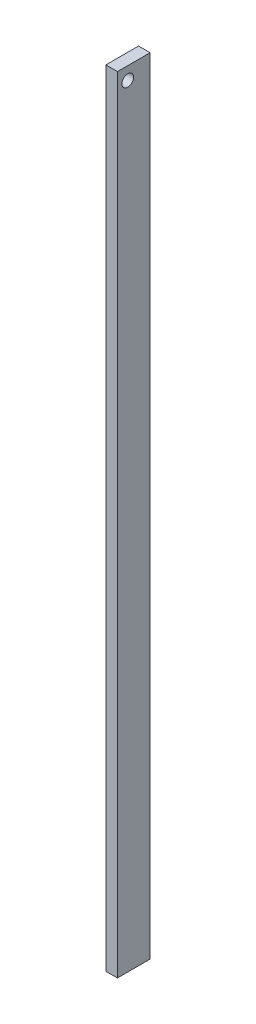
ISO-10303-21;
HEADER;
FILE_DESCRIPTION(('STEP AP214'),'2;1');
FILE_NAME('part.step','',(''),(''),'','','');
FILE_SCHEMA(('AUTOMOTIVE_DESIGN { 1 0 10303 214 1 1 1 1 }'));
ENDSEC;
DATA;
#1=APPLICATION_CONTEXT('core data for automotive mechanical design processes');
#2=APPLICATION_PROTOCOL_DEFINITION('international standard','automotive_design',2000,#1);
#3=PRODUCT_CONTEXT('',#1,'mechanical');
#4=PRODUCT('Part','Part','',(#3));
#5=PRODUCT_RELATED_PRODUCT_CATEGORY('part','',(#4));
#6=PRODUCT_DEFINITION_FORMATION('','',#4);
#7=PRODUCT_DEFINITION_CONTEXT('part definition',#1,'design');
#8=PRODUCT_DEFINITION('design','',#6,#7);
#9=PRODUCT_DEFINITION_SHAPE('','',#8);
#10=(LENGTH_UNIT() NAMED_UNIT(*) SI_UNIT(.MILLI.,.METRE.));
#11=(NAMED_UNIT(*) PLANE_ANGLE_UNIT() SI_UNIT($,.RADIAN.));
#12=(NAMED_UNIT(*) SI_UNIT($,.STERADIAN.) SOLID_ANGLE_UNIT());
#13=UNCERTAINTY_MEASURE_WITH_UNIT(LENGTH_MEASURE(1.E-05),#10,'distance_accuracy_value','');
#14=(GEOMETRIC_REPRESENTATION_CONTEXT(3) GLOBAL_UNCERTAINTY_ASSIGNED_CONTEXT((#13)) GLOBAL_UNIT_ASSIGNED_CONTEXT((#10,
#11,#12)) REPRESENTATION_CONTEXT('',''));
#15=CARTESIAN_POINT('',(0.,0.,0.));
#16=DIRECTION('',(0.,0.,1.));
#17=DIRECTION('',(1.,0.,0.));
#18=AXIS2_PLACEMENT_3D('',#15,#16,#17);
#19=CARTESIAN_POINT('',(0.,304.8,0.));
#20=DIRECTION('',(1.,0.,0.));
#21=DIRECTION('',(0.,0.,-1.));
#22=AXIS2_PLACEMENT_3D('',#19,#20,#21);
#23=PLANE('',#22);
#24=CARTESIAN_POINT('',(0.,299.8,-4.));
#25=DIRECTION('',(-1.,0.,0.));
#26=DIRECTION('',(0.,0.,1.));
#27=AXIS2_PLACEMENT_3D('',#24,#25,#26);
#28=CIRCLE('',#27,2.25);
#29=CARTESIAN_POINT('',(0.,299.8,-1.75));
#30=VERTEX_POINT('',#29);
#31=EDGE_CURVE('E110',#30,#30,#28,.T.);
#32=ORIENTED_EDGE('',*,*,#31,.F.);
#33=EDGE_LOOP('',(#32));
#34=FACE_BOUND('',#33,.T.);
#35=DIRECTION('',(0.,0.,1.));
#36=VECTOR('',#35,1.);
#37=CARTESIAN_POINT('',(0.,0.,0.));
#38=LINE('',#37,#36);
#39=CARTESIAN_POINT('',(0.,0.,-12.7));
#40=VERTEX_POINT('',#39);
#41=CARTESIAN_POINT('',(0.,0.,0.));
#42=VERTEX_POINT('',#41);
#43=EDGE_CURVE('E96',#40,#42,#38,.T.);
#44=ORIENTED_EDGE('',*,*,#43,.T.);
#45=DIRECTION('',(0.,-1.,0.));
#46=VECTOR('',#45,1.);
#47=CARTESIAN_POINT('',(0.,304.8,0.));
#48=LINE('',#47,#46);
#49=CARTESIAN_POINT('',(0.,304.8,0.));
#50=VERTEX_POINT('',#49);
#51=EDGE_CURVE('E11',#50,#42,#48,.T.);
#52=ORIENTED_EDGE('',*,*,#51,.F.);
#53=DIRECTION('',(0.,0.,1.));
#54=VECTOR('',#53,1.);
#55=CARTESIAN_POINT('',(0.,304.8,0.));
#56=LINE('',#55,#54);
#57=CARTESIAN_POINT('',(0.,304.8,-12.7));
#58=VERTEX_POINT('',#57);
#59=EDGE_CURVE('E84',#58,#50,#56,.T.);
#60=ORIENTED_EDGE('',*,*,#59,.F.);
#61=DIRECTION('',(0.,-1.,0.));
#62=VECTOR('',#61,1.);
#63=CARTESIAN_POINT('',(0.,304.8,-12.7));
#64=LINE('',#63,#62);
#65=EDGE_CURVE('E92',#58,#40,#64,.T.);
#66=ORIENTED_EDGE('',*,*,#65,.T.);
#67=EDGE_LOOP('',(#44,#52,#60,#66));
#68=FACE_BOUND('',#67,.T.);
#69=ADVANCED_FACE('F33',(#34,#68),#23,.F.);
#70=CARTESIAN_POINT('',(0.,304.8,0.));
#71=DIRECTION('',(0.,0.,-1.));
#72=DIRECTION('',(-1.,0.,0.));
#73=AXIS2_PLACEMENT_3D('',#70,#71,#72);
#74=PLANE('',#73);
#75=DIRECTION('',(1.,0.,0.));
#76=VECTOR('',#75,1.);
#77=CARTESIAN_POINT('',(0.,0.,0.));
#78=LINE('',#77,#76);
#79=CARTESIAN_POINT('',(4.5,0.,0.));
#80=VERTEX_POINT('',#79);
#81=EDGE_CURVE('E88',#42,#80,#78,.T.);
#82=ORIENTED_EDGE('',*,*,#81,.T.);
#83=DIRECTION('',(0.,-1.,0.));
#84=VECTOR('',#83,1.);
#85=CARTESIAN_POINT('',(4.5,304.8,0.));
#86=LINE('',#85,#84);
#87=CARTESIAN_POINT('',(4.5,304.8,0.));
#88=VERTEX_POINT('',#87);
#89=EDGE_CURVE('E41',#88,#80,#86,.T.);
#90=ORIENTED_EDGE('',*,*,#89,.F.);
#91=DIRECTION('',(1.,0.,0.));
#92=VECTOR('',#91,1.);
#93=CARTESIAN_POINT('',(0.,304.8,0.));
#94=LINE('',#93,#92);
#95=EDGE_CURVE('E79',#50,#88,#94,.T.);
#96=ORIENTED_EDGE('',*,*,#95,.F.);
#97=ORIENTED_EDGE('',*,*,#51,.T.);
#98=EDGE_LOOP('',(#82,#90,#96,#97));
#99=FACE_BOUND('',#98,.T.);
#100=ADVANCED_FACE('F87',(#99),#74,.F.);
#101=CARTESIAN_POINT('',(4.5,304.8,0.));
#102=DIRECTION('',(-1.,0.,0.));
#103=DIRECTION('',(0.,0.,1.));
#104=AXIS2_PLACEMENT_3D('',#101,#102,#103);
#105=PLANE('',#104);
#106=CARTESIAN_POINT('',(4.5,299.8,-4.));
#107=DIRECTION('',(-1.,0.,0.));
#108=DIRECTION('',(0.,0.,1.));
#109=AXIS2_PLACEMENT_3D('',#106,#107,#108);
#110=CIRCLE('',#109,2.25);
#111=CARTESIAN_POINT('',(4.5,299.8,-1.75));
#112=VERTEX_POINT('',#111);
#113=EDGE_CURVE('E99',#112,#112,#110,.T.);
#114=ORIENTED_EDGE('',*,*,#113,.T.);
#115=EDGE_LOOP('',(#114));
#116=FACE_BOUND('',#115,.T.);
#117=DIRECTION('',(0.,0.,-1.));
#118=VECTOR('',#117,1.);
#119=CARTESIAN_POINT('',(4.5,0.,0.));
#120=LINE('',#119,#118);
#121=CARTESIAN_POINT('',(4.5,0.,-12.7));
#122=VERTEX_POINT('',#121);
#123=EDGE_CURVE('E66',#80,#122,#120,.T.);
#124=ORIENTED_EDGE('',*,*,#123,.T.);
#125=DIRECTION('',(0.,-1.,0.));
#126=VECTOR('',#125,1.);
#127=CARTESIAN_POINT('',(4.5,304.8,-12.7));
#128=LINE('',#127,#126);
#129=CARTESIAN_POINT('',(4.5,304.8,-12.7));
#130=VERTEX_POINT('',#129);
#131=EDGE_CURVE('E89',#130,#122,#128,.T.);
#132=ORIENTED_EDGE('',*,*,#131,.F.);
#133=DIRECTION('',(0.,0.,-1.));
#134=VECTOR('',#133,1.);
#135=CARTESIAN_POINT('',(4.5,304.8,0.));
#136=LINE('',#135,#134);
#137=EDGE_CURVE('E82',#88,#130,#136,.T.);
#138=ORIENTED_EDGE('',*,*,#137,.F.);
#139=ORIENTED_EDGE('',*,*,#89,.T.);
#140=EDGE_LOOP('',(#124,#132,#138,#139));
#141=FACE_BOUND('',#140,.T.);
#142=ADVANCED_FACE('F90',(#116,#141),#105,.F.);
#143=CARTESIAN_POINT('',(0.,304.8,-12.7));
#144=DIRECTION('',(0.,0.,1.));
#145=DIRECTION('',(1.,0.,0.));
#146=AXIS2_PLACEMENT_3D('',#143,#144,#145);
#147=PLANE('',#146);
#148=DIRECTION('',(-1.,0.,0.));
#149=VECTOR('',#148,1.);
#150=CARTESIAN_POINT('',(0.,0.,-12.7));
#151=LINE('',#150,#149);
#152=EDGE_CURVE('E72',#122,#40,#151,.T.);
#153=ORIENTED_EDGE('',*,*,#152,.T.);
#154=ORIENTED_EDGE('',*,*,#65,.F.);
#155=DIRECTION('',(-1.,0.,0.));
#156=VECTOR('',#155,1.);
#157=CARTESIAN_POINT('',(0.,304.8,-12.7));
#158=LINE('',#157,#156);
#159=EDGE_CURVE('E49',#130,#58,#158,.T.);
#160=ORIENTED_EDGE('',*,*,#159,.F.);
#161=ORIENTED_EDGE('',*,*,#131,.T.);
#162=EDGE_LOOP('',(#153,#154,#160,#161));
#163=FACE_BOUND('',#162,.T.);
#164=ADVANCED_FACE('F104',(#163),#147,.F.);
#165=CARTESIAN_POINT('',(0.,304.8,0.));
#166=DIRECTION('',(0.,-1.,0.));
#167=DIRECTION('',(0.,0.,-1.));
#168=AXIS2_PLACEMENT_3D('',#165,#166,#167);
#169=PLANE('',#168);
#170=ORIENTED_EDGE('',*,*,#59,.T.);
#171=ORIENTED_EDGE('',*,*,#95,.T.);
#172=ORIENTED_EDGE('',*,*,#137,.T.);
#173=ORIENTED_EDGE('',*,*,#159,.T.);
#174=EDGE_LOOP('',(#170,#171,#172,#173));
#175=FACE_BOUND('',#174,.T.);
#176=ADVANCED_FACE('F80',(#175),#169,.F.);
#177=CARTESIAN_POINT('',(0.,0.,0.));
#178=DIRECTION('',(0.,-1.,0.));
#179=DIRECTION('',(0.,0.,-1.));
#180=AXIS2_PLACEMENT_3D('',#177,#178,#179);
#181=PLANE('',#180);
#182=ORIENTED_EDGE('',*,*,#43,.F.);
#183=ORIENTED_EDGE('',*,*,#152,.F.);
#184=ORIENTED_EDGE('',*,*,#123,.F.);
#185=ORIENTED_EDGE('',*,*,#81,.F.);
#186=EDGE_LOOP('',(#182,#183,#184,#185));
#187=FACE_BOUND('',#186,.T.);
#188=ADVANCED_FACE('F107',(#187),#181,.T.);
#189=CARTESIAN_POINT('',(4.5,299.8,-4.));
#190=DIRECTION('',(-1.,0.,0.));
#191=DIRECTION('',(0.,0.,1.));
#192=AXIS2_PLACEMENT_3D('',#189,#190,#191);
#193=CYLINDRICAL_SURFACE('',#192,2.25);
#194=ORIENTED_EDGE('',*,*,#113,.F.);
#195=EDGE_LOOP('',(#194));
#196=FACE_BOUND('',#195,.T.);
#197=ORIENTED_EDGE('',*,*,#31,.T.);
#198=EDGE_LOOP('',(#197));
#199=FACE_BOUND('',#198,.T.);
#200=ADVANCED_FACE('F117',(#196,#199),#193,.F.);
#201=CLOSED_SHELL('',(#69,#100,#142,#164,#176,#188,#200));
#202=MANIFOLD_SOLID_BREP('B2',#201);
#203=ADVANCED_BREP_SHAPE_REPRESENTATION('',(#18,#202),#14);
#204=SHAPE_DEFINITION_REPRESENTATION(#9,#203);
ENDSEC;
END-ISO-10303-21;
